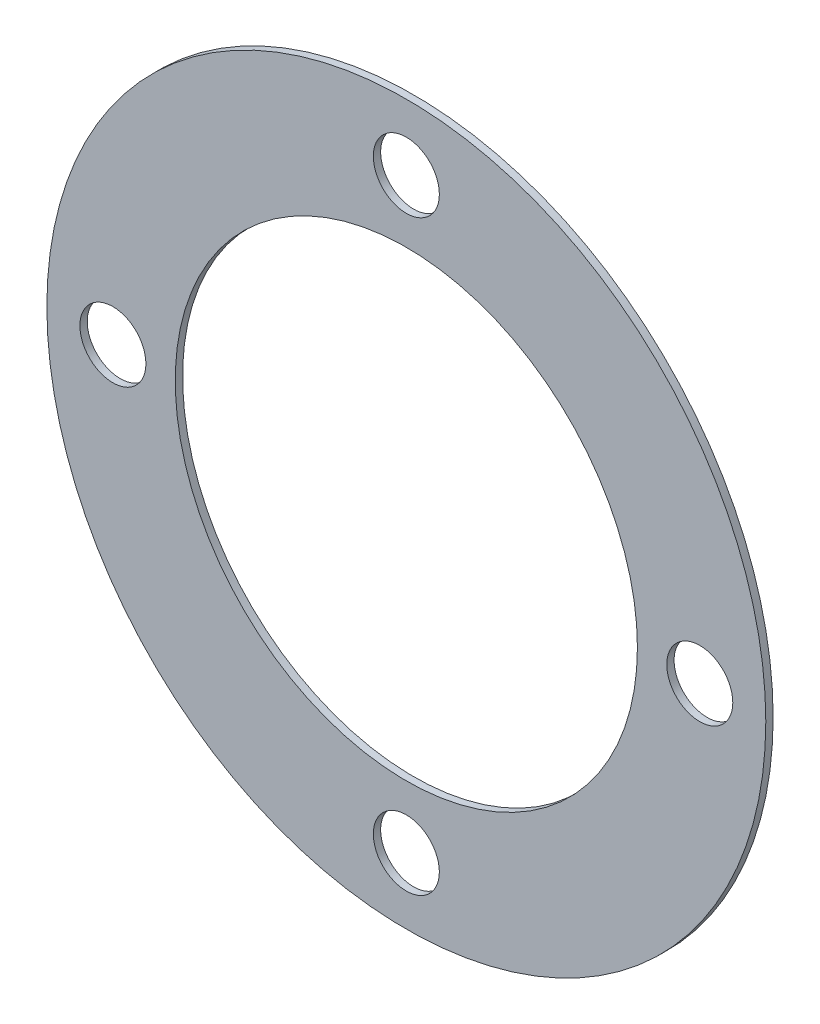
ISO-10303-21;
HEADER;
FILE_DESCRIPTION(('STEP AP214'),'2;1');
FILE_NAME('part.step','',(''),(''),'','','');
FILE_SCHEMA(('AUTOMOTIVE_DESIGN { 1 0 10303 214 1 1 1 1 }'));
ENDSEC;
DATA;
#1=APPLICATION_CONTEXT('core data for automotive mechanical design processes');
#2=APPLICATION_PROTOCOL_DEFINITION('international standard','automotive_design',2000,#1);
#3=PRODUCT_CONTEXT('',#1,'mechanical');
#4=PRODUCT('Part','Part','',(#3));
#5=PRODUCT_RELATED_PRODUCT_CATEGORY('part','',(#4));
#6=PRODUCT_DEFINITION_FORMATION('','',#4);
#7=PRODUCT_DEFINITION_CONTEXT('part definition',#1,'design');
#8=PRODUCT_DEFINITION('design','',#6,#7);
#9=PRODUCT_DEFINITION_SHAPE('','',#8);
#10=(LENGTH_UNIT() NAMED_UNIT(*) SI_UNIT(.MILLI.,.METRE.));
#11=(NAMED_UNIT(*) PLANE_ANGLE_UNIT() SI_UNIT($,.RADIAN.));
#12=(NAMED_UNIT(*) SI_UNIT($,.STERADIAN.) SOLID_ANGLE_UNIT());
#13=UNCERTAINTY_MEASURE_WITH_UNIT(LENGTH_MEASURE(1.E-05),#10,'distance_accuracy_value','');
#14=(GEOMETRIC_REPRESENTATION_CONTEXT(3) GLOBAL_UNCERTAINTY_ASSIGNED_CONTEXT((#13)) GLOBAL_UNIT_ASSIGNED_CONTEXT((#10,
#11,#12)) REPRESENTATION_CONTEXT('',''));
#15=CARTESIAN_POINT('',(0.,0.,0.));
#16=DIRECTION('',(0.,0.,1.));
#17=DIRECTION('',(1.,0.,0.));
#18=AXIS2_PLACEMENT_3D('',#15,#16,#17);
#19=CARTESIAN_POINT('',(0.,0.,1.));
#20=DIRECTION('',(0.,0.,1.));
#21=DIRECTION('',(1.,0.,0.));
#22=AXIS2_PLACEMENT_3D('',#19,#20,#21);
#23=PLANE('',#22);
#24=CARTESIAN_POINT('',(-40.,0.,1.));
#25=DIRECTION('',(0.,0.,1.));
#26=DIRECTION('',(1.,0.,0.));
#27=AXIS2_PLACEMENT_3D('',#24,#25,#26);
#28=CIRCLE('',#27,4.5);
#29=CARTESIAN_POINT('',(-35.5,0.,1.));
#30=VERTEX_POINT('',#29);
#31=EDGE_CURVE('E69',#30,#30,#28,.T.);
#32=ORIENTED_EDGE('',*,*,#31,.F.);
#33=EDGE_LOOP('',(#32));
#34=FACE_BOUND('',#33,.T.);
#35=CARTESIAN_POINT('',(0.,-40.,1.));
#36=DIRECTION('',(0.,0.,1.));
#37=DIRECTION('',(1.,0.,0.));
#38=AXIS2_PLACEMENT_3D('',#35,#36,#37);
#39=CIRCLE('',#38,4.5);
#40=CARTESIAN_POINT('',(4.5,-40.,1.));
#41=VERTEX_POINT('',#40);
#42=EDGE_CURVE('E63',#41,#41,#39,.T.);
#43=ORIENTED_EDGE('',*,*,#42,.F.);
#44=EDGE_LOOP('',(#43));
#45=FACE_BOUND('',#44,.T.);
#46=CARTESIAN_POINT('',(40.,0.,1.));
#47=DIRECTION('',(0.,0.,1.));
#48=DIRECTION('',(1.,0.,0.));
#49=AXIS2_PLACEMENT_3D('',#46,#47,#48);
#50=CIRCLE('',#49,4.5);
#51=CARTESIAN_POINT('',(44.5,0.,1.));
#52=VERTEX_POINT('',#51);
#53=EDGE_CURVE('E57',#52,#52,#50,.T.);
#54=ORIENTED_EDGE('',*,*,#53,.F.);
#55=EDGE_LOOP('',(#54));
#56=FACE_BOUND('',#55,.T.);
#57=CARTESIAN_POINT('',(0.,40.,1.));
#58=DIRECTION('',(0.,0.,1.));
#59=DIRECTION('',(1.,0.,0.));
#60=AXIS2_PLACEMENT_3D('',#57,#58,#59);
#61=CIRCLE('',#60,4.5);
#62=CARTESIAN_POINT('',(4.5,40.,1.));
#63=VERTEX_POINT('',#62);
#64=EDGE_CURVE('E51',#63,#63,#61,.T.);
#65=ORIENTED_EDGE('',*,*,#64,.F.);
#66=EDGE_LOOP('',(#65));
#67=FACE_BOUND('',#66,.T.);
#68=CARTESIAN_POINT('',(0.,0.,1.));
#69=DIRECTION('',(0.,0.,1.));
#70=DIRECTION('',(1.,0.,0.));
#71=AXIS2_PLACEMENT_3D('',#68,#69,#70);
#72=CIRCLE('',#71,49.);
#73=CARTESIAN_POINT('',(49.,0.,1.));
#74=VERTEX_POINT('',#73);
#75=EDGE_CURVE('E10',#74,#74,#72,.T.);
#76=ORIENTED_EDGE('',*,*,#75,.T.);
#77=EDGE_LOOP('',(#76));
#78=FACE_BOUND('',#77,.T.);
#79=CARTESIAN_POINT('',(0.,0.,1.));
#80=DIRECTION('',(0.,0.,1.));
#81=DIRECTION('',(1.,0.,0.));
#82=AXIS2_PLACEMENT_3D('',#79,#80,#81);
#83=CIRCLE('',#82,31.5);
#84=CARTESIAN_POINT('',(31.5,0.,1.));
#85=VERTEX_POINT('',#84);
#86=EDGE_CURVE('E43',#85,#85,#83,.T.);
#87=ORIENTED_EDGE('',*,*,#86,.F.);
#88=EDGE_LOOP('',(#87));
#89=FACE_BOUND('',#88,.T.);
#90=ADVANCED_FACE('F32',(#34,#45,#56,#67,#78,#89),#23,.T.);
#91=CARTESIAN_POINT('',(0.,0.,0.));
#92=DIRECTION('',(0.,0.,1.));
#93=DIRECTION('',(1.,0.,0.));
#94=AXIS2_PLACEMENT_3D('',#91,#92,#93);
#95=PLANE('',#94);
#96=CARTESIAN_POINT('',(-40.,0.,0.));
#97=DIRECTION('',(0.,0.,1.));
#98=DIRECTION('',(1.,0.,0.));
#99=AXIS2_PLACEMENT_3D('',#96,#97,#98);
#100=CIRCLE('',#99,4.5);
#101=CARTESIAN_POINT('',(-35.5,0.,0.));
#102=VERTEX_POINT('',#101);
#103=EDGE_CURVE('E66',#102,#102,#100,.T.);
#104=ORIENTED_EDGE('',*,*,#103,.T.);
#105=EDGE_LOOP('',(#104));
#106=FACE_BOUND('',#105,.T.);
#107=CARTESIAN_POINT('',(0.,-40.,0.));
#108=DIRECTION('',(0.,0.,1.));
#109=DIRECTION('',(1.,0.,0.));
#110=AXIS2_PLACEMENT_3D('',#107,#108,#109);
#111=CIRCLE('',#110,4.5);
#112=CARTESIAN_POINT('',(4.5,-40.,0.));
#113=VERTEX_POINT('',#112);
#114=EDGE_CURVE('E60',#113,#113,#111,.T.);
#115=ORIENTED_EDGE('',*,*,#114,.T.);
#116=EDGE_LOOP('',(#115));
#117=FACE_BOUND('',#116,.T.);
#118=CARTESIAN_POINT('',(40.,0.,0.));
#119=DIRECTION('',(0.,0.,1.));
#120=DIRECTION('',(1.,0.,0.));
#121=AXIS2_PLACEMENT_3D('',#118,#119,#120);
#122=CIRCLE('',#121,4.5);
#123=CARTESIAN_POINT('',(44.5,0.,0.));
#124=VERTEX_POINT('',#123);
#125=EDGE_CURVE('E54',#124,#124,#122,.T.);
#126=ORIENTED_EDGE('',*,*,#125,.T.);
#127=EDGE_LOOP('',(#126));
#128=FACE_BOUND('',#127,.T.);
#129=CARTESIAN_POINT('',(0.,40.,0.));
#130=DIRECTION('',(0.,0.,1.));
#131=DIRECTION('',(1.,0.,0.));
#132=AXIS2_PLACEMENT_3D('',#129,#130,#131);
#133=CIRCLE('',#132,4.5);
#134=CARTESIAN_POINT('',(4.5,40.,0.));
#135=VERTEX_POINT('',#134);
#136=EDGE_CURVE('E48',#135,#135,#133,.T.);
#137=ORIENTED_EDGE('',*,*,#136,.T.);
#138=EDGE_LOOP('',(#137));
#139=FACE_BOUND('',#138,.T.);
#140=CARTESIAN_POINT('',(0.,0.,0.));
#141=DIRECTION('',(0.,0.,1.));
#142=DIRECTION('',(1.,0.,0.));
#143=AXIS2_PLACEMENT_3D('',#140,#141,#142);
#144=CIRCLE('',#143,49.);
#145=CARTESIAN_POINT('',(49.,0.,0.));
#146=VERTEX_POINT('',#145);
#147=EDGE_CURVE('E36',#146,#146,#144,.T.);
#148=ORIENTED_EDGE('',*,*,#147,.F.);
#149=EDGE_LOOP('',(#148));
#150=FACE_BOUND('',#149,.T.);
#151=CARTESIAN_POINT('',(0.,0.,0.));
#152=DIRECTION('',(0.,0.,1.));
#153=DIRECTION('',(1.,0.,0.));
#154=AXIS2_PLACEMENT_3D('',#151,#152,#153);
#155=CIRCLE('',#154,31.5);
#156=CARTESIAN_POINT('',(31.5,0.,0.));
#157=VERTEX_POINT('',#156);
#158=EDGE_CURVE('E45',#157,#157,#155,.T.);
#159=ORIENTED_EDGE('',*,*,#158,.T.);
#160=EDGE_LOOP('',(#159));
#161=FACE_BOUND('',#160,.T.);
#162=ADVANCED_FACE('F75',(#106,#117,#128,#139,#150,#161),#95,.F.);
#163=CARTESIAN_POINT('',(0.,0.,1.));
#164=DIRECTION('',(0.,0.,-1.));
#165=DIRECTION('',(-1.,0.,0.));
#166=AXIS2_PLACEMENT_3D('',#163,#164,#165);
#167=CYLINDRICAL_SURFACE('',#166,49.);
#168=ORIENTED_EDGE('',*,*,#75,.F.);
#169=EDGE_LOOP('',(#168));
#170=FACE_BOUND('',#169,.T.);
#171=ORIENTED_EDGE('',*,*,#147,.T.);
#172=EDGE_LOOP('',(#171));
#173=FACE_BOUND('',#172,.T.);
#174=ADVANCED_FACE('F34',(#170,#173),#167,.T.);
#175=CARTESIAN_POINT('',(0.,0.,1.));
#176=DIRECTION('',(0.,0.,-1.));
#177=DIRECTION('',(-1.,0.,0.));
#178=AXIS2_PLACEMENT_3D('',#175,#176,#177);
#179=CYLINDRICAL_SURFACE('',#178,31.5);
#180=ORIENTED_EDGE('',*,*,#86,.T.);
#181=EDGE_LOOP('',(#180));
#182=FACE_BOUND('',#181,.T.);
#183=ORIENTED_EDGE('',*,*,#158,.F.);
#184=EDGE_LOOP('',(#183));
#185=FACE_BOUND('',#184,.T.);
#186=ADVANCED_FACE('F96',(#182,#185),#179,.F.);
#187=CARTESIAN_POINT('',(0.,40.,0.));
#188=DIRECTION('',(0.,0.,1.));
#189=DIRECTION('',(1.,0.,0.));
#190=AXIS2_PLACEMENT_3D('',#187,#188,#189);
#191=CYLINDRICAL_SURFACE('',#190,4.5);
#192=ORIENTED_EDGE('',*,*,#136,.F.);
#193=EDGE_LOOP('',(#192));
#194=FACE_BOUND('',#193,.T.);
#195=ORIENTED_EDGE('',*,*,#64,.T.);
#196=EDGE_LOOP('',(#195));
#197=FACE_BOUND('',#196,.T.);
#198=ADVANCED_FACE('F99',(#194,#197),#191,.F.);
#199=CARTESIAN_POINT('',(40.,0.,0.));
#200=DIRECTION('',(0.,0.,1.));
#201=DIRECTION('',(1.,0.,0.));
#202=AXIS2_PLACEMENT_3D('',#199,#200,#201);
#203=CYLINDRICAL_SURFACE('',#202,4.5);
#204=ORIENTED_EDGE('',*,*,#125,.F.);
#205=EDGE_LOOP('',(#204));
#206=FACE_BOUND('',#205,.T.);
#207=ORIENTED_EDGE('',*,*,#53,.T.);
#208=EDGE_LOOP('',(#207));
#209=FACE_BOUND('',#208,.T.);
#210=ADVANCED_FACE('F111',(#206,#209),#203,.F.);
#211=CARTESIAN_POINT('',(0.,-40.,0.));
#212=DIRECTION('',(0.,0.,1.));
#213=DIRECTION('',(1.,0.,0.));
#214=AXIS2_PLACEMENT_3D('',#211,#212,#213);
#215=CYLINDRICAL_SURFACE('',#214,4.5);
#216=ORIENTED_EDGE('',*,*,#114,.F.);
#217=EDGE_LOOP('',(#216));
#218=FACE_BOUND('',#217,.T.);
#219=ORIENTED_EDGE('',*,*,#42,.T.);
#220=EDGE_LOOP('',(#219));
#221=FACE_BOUND('',#220,.T.);
#222=ADVANCED_FACE('F81',(#218,#221),#215,.F.);
#223=CARTESIAN_POINT('',(-40.,0.,0.));
#224=DIRECTION('',(0.,0.,1.));
#225=DIRECTION('',(1.,0.,0.));
#226=AXIS2_PLACEMENT_3D('',#223,#224,#225);
#227=CYLINDRICAL_SURFACE('',#226,4.5);
#228=ORIENTED_EDGE('',*,*,#103,.F.);
#229=EDGE_LOOP('',(#228));
#230=FACE_BOUND('',#229,.T.);
#231=ORIENTED_EDGE('',*,*,#31,.T.);
#232=EDGE_LOOP('',(#231));
#233=FACE_BOUND('',#232,.T.);
#234=ADVANCED_FACE('F78',(#230,#233),#227,.F.);
#235=CLOSED_SHELL('',(#90,#162,#174,#186,#198,#210,#222,#234));
#236=MANIFOLD_SOLID_BREP('B2',#235);
#237=ADVANCED_BREP_SHAPE_REPRESENTATION('',(#18,#236),#14);
#238=SHAPE_DEFINITION_REPRESENTATION(#9,#237);
ENDSEC;
END-ISO-10303-21;
